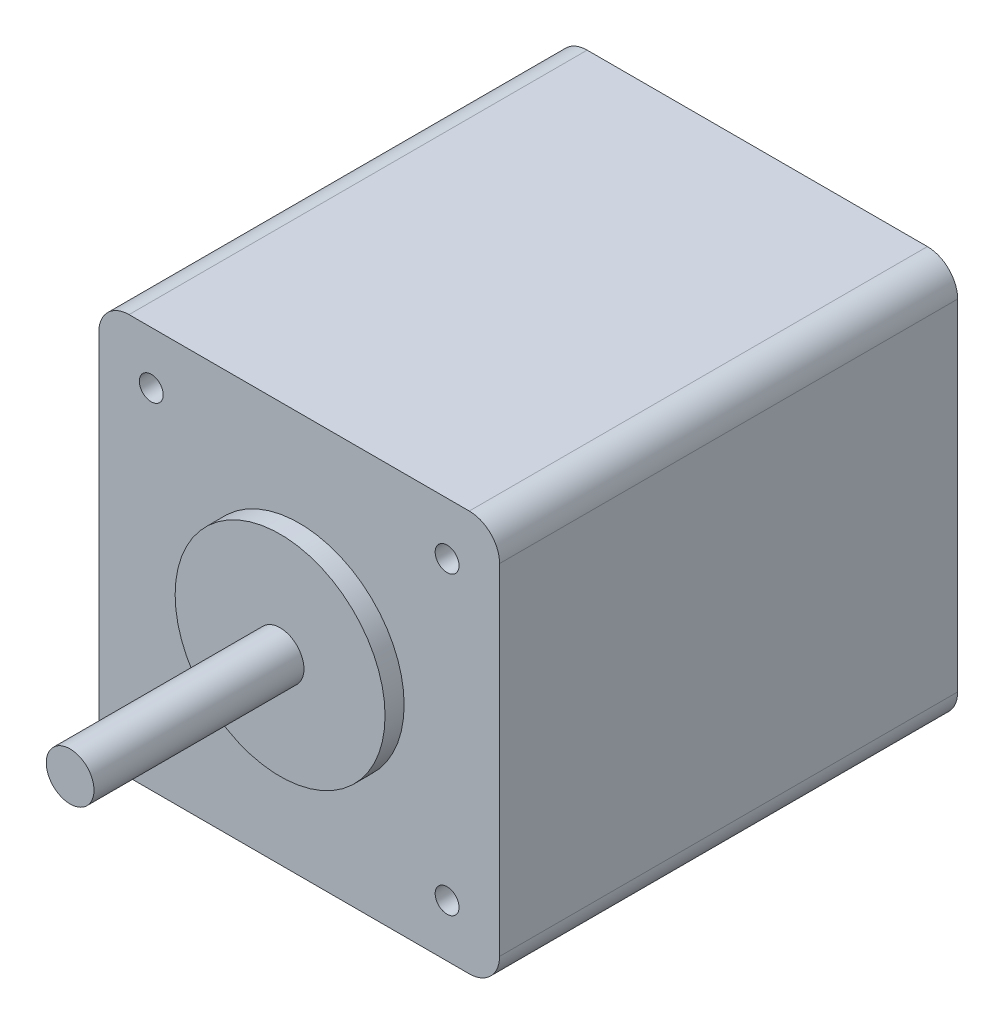
ISO-10303-21;
HEADER;
FILE_DESCRIPTION(('STEP AP214'),'2;1');
FILE_NAME('part.step','',(''),(''),'','','');
FILE_SCHEMA(('AUTOMOTIVE_DESIGN { 1 0 10303 214 1 1 1 1 }'));
ENDSEC;
DATA;
#1=APPLICATION_CONTEXT('core data for automotive mechanical design processes');
#2=APPLICATION_PROTOCOL_DEFINITION('international standard','automotive_design',2000,#1);
#3=PRODUCT_CONTEXT('',#1,'mechanical');
#4=PRODUCT('Part','Part','',(#3));
#5=PRODUCT_RELATED_PRODUCT_CATEGORY('part','',(#4));
#6=PRODUCT_DEFINITION_FORMATION('','',#4);
#7=PRODUCT_DEFINITION_CONTEXT('part definition',#1,'design');
#8=PRODUCT_DEFINITION('design','',#6,#7);
#9=PRODUCT_DEFINITION_SHAPE('','',#8);
#10=(LENGTH_UNIT() NAMED_UNIT(*) SI_UNIT(.MILLI.,.METRE.));
#11=(NAMED_UNIT(*) PLANE_ANGLE_UNIT() SI_UNIT($,.RADIAN.));
#12=(NAMED_UNIT(*) SI_UNIT($,.STERADIAN.) SOLID_ANGLE_UNIT());
#13=UNCERTAINTY_MEASURE_WITH_UNIT(LENGTH_MEASURE(1.E-05),#10,'distance_accuracy_value','');
#14=(GEOMETRIC_REPRESENTATION_CONTEXT(3) GLOBAL_UNCERTAINTY_ASSIGNED_CONTEXT((#13)) GLOBAL_UNIT_ASSIGNED_CONTEXT((#10,
#11,#12)) REPRESENTATION_CONTEXT('',''));
#15=CARTESIAN_POINT('',(0.,0.,0.));
#16=DIRECTION('',(0.,0.,1.));
#17=DIRECTION('',(1.,0.,0.));
#18=AXIS2_PLACEMENT_3D('',#15,#16,#17);
#19=CARTESIAN_POINT('',(0.,0.,57.02));
#20=DIRECTION('',(0.,0.,1.));
#21=DIRECTION('',(1.,0.,0.));
#22=AXIS2_PLACEMENT_3D('',#19,#20,#21);
#23=PLANE('',#22);
#24=CARTESIAN_POINT('',(0.,0.,57.02));
#25=DIRECTION('',(0.,0.,1.));
#26=DIRECTION('',(1.,0.,0.));
#27=AXIS2_PLACEMENT_3D('',#24,#25,#26);
#28=CIRCLE('',#27,2.5);
#29=CARTESIAN_POINT('',(2.5,0.,57.02));
#30=VERTEX_POINT('',#29);
#31=EDGE_CURVE('E20',#30,#30,#28,.F.);
#32=ORIENTED_EDGE('',*,*,#31,.F.);
#33=EDGE_LOOP('',(#32));
#34=FACE_BOUND('',#33,.T.);
#35=ADVANCED_FACE('F17',(#34),#23,.T.);
#36=CARTESIAN_POINT('',(0.,0.,33.02));
#37=DIRECTION('',(0.,0.,1.));
#38=DIRECTION('',(1.,0.,0.));
#39=AXIS2_PLACEMENT_3D('',#36,#37,#38);
#40=CYLINDRICAL_SURFACE('',#39,2.5);
#41=ORIENTED_EDGE('',*,*,#31,.T.);
#42=EDGE_LOOP('',(#41));
#43=FACE_BOUND('',#42,.T.);
#44=CARTESIAN_POINT('',(0.,0.,35.02));
#45=DIRECTION('',(0.,0.,1.));
#46=DIRECTION('',(1.,0.,0.));
#47=AXIS2_PLACEMENT_3D('',#44,#45,#46);
#48=CIRCLE('',#47,2.5);
#49=CARTESIAN_POINT('',(2.5,0.,35.02));
#50=VERTEX_POINT('',#49);
#51=EDGE_CURVE('E105',#50,#50,#48,.F.);
#52=ORIENTED_EDGE('',*,*,#51,.F.);
#53=EDGE_LOOP('',(#52));
#54=FACE_BOUND('',#53,.T.);
#55=ADVANCED_FACE('F98',(#43,#54),#40,.T.);
#56=CARTESIAN_POINT('',(-15.5,15.5,25.5199999999149));
#57=DIRECTION('',(0.,0.,1.));
#58=DIRECTION('',(0.,-1.,0.));
#59=AXIS2_PLACEMENT_3D('',#56,#57,#58);
#60=CONICAL_SURFACE('',#59,1.24999999988222,1.02974425852598);
#61=CARTESIAN_POINT('',(-15.5000000001451,15.5,24.7689242261231));
#62=VERTEX_POINT('',#61);
#63=VERTEX_LOOP('',#62);
#64=FACE_BOUND('',#63,.T.);
#65=CARTESIAN_POINT('',(-15.5,15.5,25.52));
#66=DIRECTION('',(0.,0.,1.));
#67=DIRECTION('',(1.,0.,0.));
#68=AXIS2_PLACEMENT_3D('',#65,#66,#67);
#69=CIRCLE('',#68,1.25);
#70=CARTESIAN_POINT('',(-14.25,15.5,25.52));
#71=VERTEX_POINT('',#70);
#72=EDGE_CURVE('E102',#71,#71,#69,.T.);
#73=ORIENTED_EDGE('',*,*,#72,.T.);
#74=EDGE_LOOP('',(#73));
#75=FACE_BOUND('',#74,.T.);
#76=ADVANCED_FACE('F94',(#64,#75),#60,.F.);
#77=CARTESIAN_POINT('',(-15.5,-15.5,25.5199999999149));
#78=DIRECTION('',(0.,0.,1.));
#79=DIRECTION('',(0.,-1.,0.));
#80=AXIS2_PLACEMENT_3D('',#77,#78,#79);
#81=CONICAL_SURFACE('',#80,1.24999999988222,1.02974425852598);
#82=CARTESIAN_POINT('',(-15.5000000001451,-15.5,24.7689242261231));
#83=VERTEX_POINT('',#82);
#84=VERTEX_LOOP('',#83);
#85=FACE_BOUND('',#84,.T.);
#86=CARTESIAN_POINT('',(-15.5,-15.5,25.52));
#87=DIRECTION('',(0.,0.,1.));
#88=DIRECTION('',(1.,0.,0.));
#89=AXIS2_PLACEMENT_3D('',#86,#87,#88);
#90=CIRCLE('',#89,1.25);
#91=CARTESIAN_POINT('',(-14.25,-15.5,25.52));
#92=VERTEX_POINT('',#91);
#93=EDGE_CURVE('E104',#92,#92,#90,.T.);
#94=ORIENTED_EDGE('',*,*,#93,.T.);
#95=EDGE_LOOP('',(#94));
#96=FACE_BOUND('',#95,.T.);
#97=ADVANCED_FACE('F97',(#85,#96),#81,.F.);
#98=CARTESIAN_POINT('',(15.5,-15.5,25.5199999998581));
#99=DIRECTION('',(0.,0.,1.));
#100=DIRECTION('',(1.,0.,0.));
#101=AXIS2_PLACEMENT_3D('',#98,#99,#100);
#102=CONICAL_SURFACE('',#101,1.24999999983129,1.02974425834288);
#103=CARTESIAN_POINT('',(15.4999999997472,-15.5,24.7689242260094));
#104=VERTEX_POINT('',#103);
#105=VERTEX_LOOP('',#104);
#106=FACE_BOUND('',#105,.T.);
#107=CARTESIAN_POINT('',(15.5,-15.5,25.52));
#108=DIRECTION('',(0.,0.,1.));
#109=DIRECTION('',(1.,0.,0.));
#110=AXIS2_PLACEMENT_3D('',#107,#108,#109);
#111=CIRCLE('',#110,1.25);
#112=CARTESIAN_POINT('',(16.75,-15.5,25.52));
#113=VERTEX_POINT('',#112);
#114=EDGE_CURVE('E108',#113,#113,#111,.T.);
#115=ORIENTED_EDGE('',*,*,#114,.T.);
#116=EDGE_LOOP('',(#115));
#117=FACE_BOUND('',#116,.T.);
#118=ADVANCED_FACE('F298',(#106,#117),#102,.F.);
#119=CARTESIAN_POINT('',(15.5,15.5,25.5199999998581));
#120=DIRECTION('',(0.,0.,1.));
#121=DIRECTION('',(1.,0.,0.));
#122=AXIS2_PLACEMENT_3D('',#119,#120,#121);
#123=CONICAL_SURFACE('',#122,1.24999999983129,1.02974425834288);
#124=CARTESIAN_POINT('',(15.4999999997472,15.5,24.7689242260094));
#125=VERTEX_POINT('',#124);
#126=VERTEX_LOOP('',#125);
#127=FACE_BOUND('',#126,.T.);
#128=CARTESIAN_POINT('',(15.5,15.5,25.52));
#129=DIRECTION('',(0.,0.,1.));
#130=DIRECTION('',(1.,0.,0.));
#131=AXIS2_PLACEMENT_3D('',#128,#129,#130);
#132=CIRCLE('',#131,1.25);
#133=CARTESIAN_POINT('',(16.75,15.5,25.52));
#134=VERTEX_POINT('',#133);
#135=EDGE_CURVE('E163',#134,#134,#132,.T.);
#136=ORIENTED_EDGE('',*,*,#135,.T.);
#137=EDGE_LOOP('',(#136));
#138=FACE_BOUND('',#137,.T.);
#139=ADVANCED_FACE('F261',(#127,#138),#123,.F.);
#140=CARTESIAN_POINT('',(2.5,0.,35.02));
#141=DIRECTION('',(0.,0.,1.));
#142=DIRECTION('',(1.,0.,0.));
#143=AXIS2_PLACEMENT_3D('',#140,#141,#142);
#144=PLANE('',#143);
#145=ORIENTED_EDGE('',*,*,#51,.T.);
#146=EDGE_LOOP('',(#145));
#147=FACE_BOUND('',#146,.T.);
#148=CARTESIAN_POINT('',(0.,0.,35.02));
#149=DIRECTION('',(0.,0.,1.));
#150=DIRECTION('',(1.,0.,0.));
#151=AXIS2_PLACEMENT_3D('',#148,#149,#150);
#152=CIRCLE('',#151,10.9982);
#153=CARTESIAN_POINT('',(10.9982,0.,35.02));
#154=VERTEX_POINT('',#153);
#155=EDGE_CURVE('E161',#154,#154,#152,.F.);
#156=ORIENTED_EDGE('',*,*,#155,.F.);
#157=EDGE_LOOP('',(#156));
#158=FACE_BOUND('',#157,.T.);
#159=ADVANCED_FACE('F251',(#147,#158),#144,.T.);
#160=CARTESIAN_POINT('',(-15.5,15.5,33.02));
#161=DIRECTION('',(0.,0.,1.));
#162=DIRECTION('',(1.,0.,0.));
#163=AXIS2_PLACEMENT_3D('',#160,#161,#162);
#164=CYLINDRICAL_SURFACE('',#163,1.25);
#165=CARTESIAN_POINT('',(-15.5,15.5,33.02));
#166=DIRECTION('',(0.,0.,1.));
#167=DIRECTION('',(1.,0.,0.));
#168=AXIS2_PLACEMENT_3D('',#165,#166,#167);
#169=CIRCLE('',#168,1.25);
#170=CARTESIAN_POINT('',(-14.25,15.5,33.02));
#171=VERTEX_POINT('',#170);
#172=EDGE_CURVE('E158',#171,#171,#169,.F.);
#173=ORIENTED_EDGE('',*,*,#172,.F.);
#174=EDGE_LOOP('',(#173));
#175=FACE_BOUND('',#174,.T.);
#176=ORIENTED_EDGE('',*,*,#72,.F.);
#177=EDGE_LOOP('',(#176));
#178=FACE_BOUND('',#177,.T.);
#179=ADVANCED_FACE('F248',(#175,#178),#164,.F.);
#180=CARTESIAN_POINT('',(-15.5,-15.5,33.02));
#181=DIRECTION('',(0.,0.,1.));
#182=DIRECTION('',(1.,0.,0.));
#183=AXIS2_PLACEMENT_3D('',#180,#181,#182);
#184=CYLINDRICAL_SURFACE('',#183,1.25);
#185=CARTESIAN_POINT('',(-15.5,-15.5,33.02));
#186=DIRECTION('',(0.,0.,1.));
#187=DIRECTION('',(1.,0.,0.));
#188=AXIS2_PLACEMENT_3D('',#185,#186,#187);
#189=CIRCLE('',#188,1.25);
#190=CARTESIAN_POINT('',(-14.25,-15.5,33.02));
#191=VERTEX_POINT('',#190);
#192=EDGE_CURVE('E155',#191,#191,#189,.F.);
#193=ORIENTED_EDGE('',*,*,#192,.F.);
#194=EDGE_LOOP('',(#193));
#195=FACE_BOUND('',#194,.T.);
#196=ORIENTED_EDGE('',*,*,#93,.F.);
#197=EDGE_LOOP('',(#196));
#198=FACE_BOUND('',#197,.T.);
#199=ADVANCED_FACE('F250',(#195,#198),#184,.F.);
#200=CARTESIAN_POINT('',(15.5,-15.5,33.02));
#201=DIRECTION('',(0.,0.,1.));
#202=DIRECTION('',(1.,0.,0.));
#203=AXIS2_PLACEMENT_3D('',#200,#201,#202);
#204=CYLINDRICAL_SURFACE('',#203,1.25);
#205=CARTESIAN_POINT('',(15.5,-15.5,33.02));
#206=DIRECTION('',(0.,0.,1.));
#207=DIRECTION('',(1.,0.,0.));
#208=AXIS2_PLACEMENT_3D('',#205,#206,#207);
#209=CIRCLE('',#208,1.25);
#210=CARTESIAN_POINT('',(16.75,-15.5,33.02));
#211=VERTEX_POINT('',#210);
#212=EDGE_CURVE('E152',#211,#211,#209,.F.);
#213=ORIENTED_EDGE('',*,*,#212,.F.);
#214=EDGE_LOOP('',(#213));
#215=FACE_BOUND('',#214,.T.);
#216=ORIENTED_EDGE('',*,*,#114,.F.);
#217=EDGE_LOOP('',(#216));
#218=FACE_BOUND('',#217,.T.);
#219=ADVANCED_FACE('F258',(#215,#218),#204,.F.);
#220=CARTESIAN_POINT('',(15.5,15.5,33.02));
#221=DIRECTION('',(0.,0.,1.));
#222=DIRECTION('',(1.,0.,0.));
#223=AXIS2_PLACEMENT_3D('',#220,#221,#222);
#224=CYLINDRICAL_SURFACE('',#223,1.25);
#225=CARTESIAN_POINT('',(15.5,15.5,33.02));
#226=DIRECTION('',(0.,0.,1.));
#227=DIRECTION('',(1.,0.,0.));
#228=AXIS2_PLACEMENT_3D('',#225,#226,#227);
#229=CIRCLE('',#228,1.25);
#230=CARTESIAN_POINT('',(16.75,15.5,33.02));
#231=VERTEX_POINT('',#230);
#232=EDGE_CURVE('E149',#231,#231,#229,.F.);
#233=ORIENTED_EDGE('',*,*,#232,.F.);
#234=EDGE_LOOP('',(#233));
#235=FACE_BOUND('',#234,.T.);
#236=ORIENTED_EDGE('',*,*,#135,.F.);
#237=EDGE_LOOP('',(#236));
#238=FACE_BOUND('',#237,.T.);
#239=ADVANCED_FACE('F287',(#235,#238),#224,.F.);
#240=CARTESIAN_POINT('',(0.,0.,33.02));
#241=DIRECTION('',(0.,0.,1.));
#242=DIRECTION('',(1.,0.,0.));
#243=AXIS2_PLACEMENT_3D('',#240,#241,#242);
#244=CYLINDRICAL_SURFACE('',#243,10.9982);
#245=ORIENTED_EDGE('',*,*,#155,.T.);
#246=EDGE_LOOP('',(#245));
#247=FACE_BOUND('',#246,.T.);
#248=CARTESIAN_POINT('',(0.,0.,33.02));
#249=DIRECTION('',(0.,0.,1.));
#250=DIRECTION('',(1.,0.,0.));
#251=AXIS2_PLACEMENT_3D('',#248,#249,#250);
#252=CIRCLE('',#251,10.9982);
#253=CARTESIAN_POINT('',(10.9982,0.,33.02));
#254=VERTEX_POINT('',#253);
#255=EDGE_CURVE('E146',#254,#254,#252,.F.);
#256=ORIENTED_EDGE('',*,*,#255,.F.);
#257=EDGE_LOOP('',(#256));
#258=FACE_BOUND('',#257,.T.);
#259=ADVANCED_FACE('F236',(#247,#258),#244,.T.);
#260=CARTESIAN_POINT('',(21.,-21.,33.02));
#261=DIRECTION('',(0.,0.,1.));
#262=DIRECTION('',(1.,0.,0.));
#263=AXIS2_PLACEMENT_3D('',#260,#261,#262);
#264=PLANE('',#263);
#265=DIRECTION('',(0.,1.,0.));
#266=VECTOR('',#265,1.);
#267=CARTESIAN_POINT('',(21.,-21.,33.02));
#268=LINE('',#267,#266);
#269=CARTESIAN_POINT('',(21.,17.825,33.02));
#270=VERTEX_POINT('',#269);
#271=CARTESIAN_POINT('',(21.,-17.825,33.02));
#272=VERTEX_POINT('',#271);
#273=EDGE_CURVE('E178',#270,#272,#268,.F.);
#274=ORIENTED_EDGE('',*,*,#273,.F.);
#275=CARTESIAN_POINT('',(17.825,17.825,33.02));
#276=DIRECTION('',(0.,0.,1.));
#277=DIRECTION('',(1.,0.,0.));
#278=AXIS2_PLACEMENT_3D('',#275,#276,#277);
#279=CIRCLE('',#278,3.175);
#280=CARTESIAN_POINT('',(17.825,21.,33.02));
#281=VERTEX_POINT('',#280);
#282=EDGE_CURVE('E135',#281,#270,#279,.F.);
#283=ORIENTED_EDGE('',*,*,#282,.F.);
#284=DIRECTION('',(1.,0.,0.));
#285=VECTOR('',#284,1.);
#286=CARTESIAN_POINT('',(21.,21.,33.02));
#287=LINE('',#286,#285);
#288=CARTESIAN_POINT('',(-17.825,21.,33.02));
#289=VERTEX_POINT('',#288);
#290=EDGE_CURVE('E180',#289,#281,#287,.T.);
#291=ORIENTED_EDGE('',*,*,#290,.F.);
#292=CARTESIAN_POINT('',(-17.825,17.825,33.02));
#293=DIRECTION('',(0.,0.,1.));
#294=DIRECTION('',(1.,0.,0.));
#295=AXIS2_PLACEMENT_3D('',#292,#293,#294);
#296=CIRCLE('',#295,3.175);
#297=CARTESIAN_POINT('',(-21.,17.825,33.02));
#298=VERTEX_POINT('',#297);
#299=EDGE_CURVE('E131',#298,#289,#296,.F.);
#300=ORIENTED_EDGE('',*,*,#299,.F.);
#301=DIRECTION('',(0.,1.,0.));
#302=VECTOR('',#301,1.);
#303=CARTESIAN_POINT('',(-21.,21.,33.02));
#304=LINE('',#303,#302);
#305=CARTESIAN_POINT('',(-21.,-17.825,33.02));
#306=VERTEX_POINT('',#305);
#307=EDGE_CURVE('E182',#306,#298,#304,.T.);
#308=ORIENTED_EDGE('',*,*,#307,.F.);
#309=CARTESIAN_POINT('',(-17.825,-17.825,33.02));
#310=DIRECTION('',(0.,0.,1.));
#311=DIRECTION('',(1.,0.,0.));
#312=AXIS2_PLACEMENT_3D('',#309,#310,#311);
#313=CIRCLE('',#312,3.175);
#314=CARTESIAN_POINT('',(-17.825,-21.,33.02));
#315=VERTEX_POINT('',#314);
#316=EDGE_CURVE('E143',#315,#306,#313,.F.);
#317=ORIENTED_EDGE('',*,*,#316,.F.);
#318=DIRECTION('',(1.,0.,0.));
#319=VECTOR('',#318,1.);
#320=CARTESIAN_POINT('',(-21.,-21.,33.02));
#321=LINE('',#320,#319);
#322=CARTESIAN_POINT('',(17.825,-21.,33.02));
#323=VERTEX_POINT('',#322);
#324=EDGE_CURVE('E80',#323,#315,#321,.F.);
#325=ORIENTED_EDGE('',*,*,#324,.F.);
#326=CARTESIAN_POINT('',(17.825,-17.825,33.02));
#327=DIRECTION('',(0.,0.,1.));
#328=DIRECTION('',(1.,0.,0.));
#329=AXIS2_PLACEMENT_3D('',#326,#327,#328);
#330=CIRCLE('',#329,3.175);
#331=EDGE_CURVE('E139',#272,#323,#330,.F.);
#332=ORIENTED_EDGE('',*,*,#331,.F.);
#333=EDGE_LOOP('',(#274,#283,#291,#300,#308,#317,#325,#332));
#334=FACE_BOUND('',#333,.T.);
#335=ORIENTED_EDGE('',*,*,#255,.T.);
#336=EDGE_LOOP('',(#335));
#337=FACE_BOUND('',#336,.T.);
#338=ORIENTED_EDGE('',*,*,#232,.T.);
#339=EDGE_LOOP('',(#338));
#340=FACE_BOUND('',#339,.T.);
#341=ORIENTED_EDGE('',*,*,#212,.T.);
#342=EDGE_LOOP('',(#341));
#343=FACE_BOUND('',#342,.T.);
#344=ORIENTED_EDGE('',*,*,#192,.T.);
#345=EDGE_LOOP('',(#344));
#346=FACE_BOUND('',#345,.T.);
#347=ORIENTED_EDGE('',*,*,#172,.T.);
#348=EDGE_LOOP('',(#347));
#349=FACE_BOUND('',#348,.T.);
#350=ADVANCED_FACE('F233',(#334,#337,#340,#343,#346,#349),#264,.T.);
#351=CARTESIAN_POINT('',(-17.825,-17.825,-14.98));
#352=DIRECTION('',(0.,0.,1.));
#353=DIRECTION('',(1.,0.,0.));
#354=AXIS2_PLACEMENT_3D('',#351,#352,#353);
#355=CYLINDRICAL_SURFACE('',#354,3.175);
#356=ORIENTED_EDGE('',*,*,#316,.T.);
#357=DIRECTION('',(0.,0.,1.));
#358=VECTOR('',#357,1.);
#359=CARTESIAN_POINT('',(-21.,-17.825,-14.98));
#360=LINE('',#359,#358);
#361=CARTESIAN_POINT('',(-21.,-17.825,-14.98));
#362=VERTEX_POINT('',#361);
#363=EDGE_CURVE('E130',#362,#306,#360,.T.);
#364=ORIENTED_EDGE('',*,*,#363,.F.);
#365=CARTESIAN_POINT('',(-17.825,-17.825,-14.98));
#366=DIRECTION('',(0.,0.,1.));
#367=DIRECTION('',(1.,0.,0.));
#368=AXIS2_PLACEMENT_3D('',#365,#366,#367);
#369=CIRCLE('',#368,3.175);
#370=CARTESIAN_POINT('',(-17.825,-21.,-14.98));
#371=VERTEX_POINT('',#370);
#372=EDGE_CURVE('E127',#362,#371,#369,.T.);
#373=ORIENTED_EDGE('',*,*,#372,.T.);
#374=DIRECTION('',(0.,0.,-1.));
#375=VECTOR('',#374,1.);
#376=CARTESIAN_POINT('',(-17.825,-21.,-14.98));
#377=LINE('',#376,#375);
#378=EDGE_CURVE('E142',#315,#371,#377,.T.);
#379=ORIENTED_EDGE('',*,*,#378,.F.);
#380=EDGE_LOOP('',(#356,#364,#373,#379));
#381=FACE_BOUND('',#380,.T.);
#382=ADVANCED_FACE('F225',(#381),#355,.T.);
#383=CARTESIAN_POINT('',(-21.,-21.,-14.98));
#384=DIRECTION('',(0.,-1.,0.));
#385=DIRECTION('',(0.,0.,-1.));
#386=AXIS2_PLACEMENT_3D('',#383,#384,#385);
#387=PLANE('',#386);
#388=DIRECTION('',(1.,0.,0.));
#389=VECTOR('',#388,1.);
#390=CARTESIAN_POINT('',(21.,-21.,-14.98));
#391=LINE('',#390,#389);
#392=CARTESIAN_POINT('',(17.825,-21.,-14.98));
#393=VERTEX_POINT('',#392);
#394=EDGE_CURVE('E126',#371,#393,#391,.T.);
#395=ORIENTED_EDGE('',*,*,#394,.T.);
#396=DIRECTION('',(0.,0.,1.));
#397=VECTOR('',#396,1.);
#398=CARTESIAN_POINT('',(17.825,-21.,-14.98));
#399=LINE('',#398,#397);
#400=EDGE_CURVE('E141',#323,#393,#399,.F.);
#401=ORIENTED_EDGE('',*,*,#400,.F.);
#402=ORIENTED_EDGE('',*,*,#324,.T.);
#403=ORIENTED_EDGE('',*,*,#378,.T.);
#404=EDGE_LOOP('',(#395,#401,#402,#403));
#405=FACE_BOUND('',#404,.T.);
#406=ADVANCED_FACE('F221',(#405),#387,.T.);
#407=CARTESIAN_POINT('',(17.825,-17.825,-14.98));
#408=DIRECTION('',(0.,0.,1.));
#409=DIRECTION('',(1.,0.,0.));
#410=AXIS2_PLACEMENT_3D('',#407,#408,#409);
#411=CYLINDRICAL_SURFACE('',#410,3.175);
#412=ORIENTED_EDGE('',*,*,#331,.T.);
#413=ORIENTED_EDGE('',*,*,#400,.T.);
#414=CARTESIAN_POINT('',(17.825,-17.825,-14.98));
#415=DIRECTION('',(0.,0.,1.));
#416=DIRECTION('',(1.,0.,0.));
#417=AXIS2_PLACEMENT_3D('',#414,#415,#416);
#418=CIRCLE('',#417,3.175);
#419=CARTESIAN_POINT('',(21.,-17.825,-14.98));
#420=VERTEX_POINT('',#419);
#421=EDGE_CURVE('E123',#393,#420,#418,.T.);
#422=ORIENTED_EDGE('',*,*,#421,.T.);
#423=DIRECTION('',(0.,0.,-1.));
#424=VECTOR('',#423,1.);
#425=CARTESIAN_POINT('',(21.,-17.825,-14.98));
#426=LINE('',#425,#424);
#427=EDGE_CURVE('E138',#272,#420,#426,.T.);
#428=ORIENTED_EDGE('',*,*,#427,.F.);
#429=EDGE_LOOP('',(#412,#413,#422,#428));
#430=FACE_BOUND('',#429,.T.);
#431=ADVANCED_FACE('F220',(#430),#411,.T.);
#432=CARTESIAN_POINT('',(21.,-21.,-14.98));
#433=DIRECTION('',(1.,0.,0.));
#434=DIRECTION('',(0.,0.,-1.));
#435=AXIS2_PLACEMENT_3D('',#432,#433,#434);
#436=PLANE('',#435);
#437=ORIENTED_EDGE('',*,*,#273,.T.);
#438=ORIENTED_EDGE('',*,*,#427,.T.);
#439=DIRECTION('',(0.,1.,0.));
#440=VECTOR('',#439,1.);
#441=CARTESIAN_POINT('',(21.,-21.,-14.98));
#442=LINE('',#441,#440);
#443=CARTESIAN_POINT('',(21.,17.825,-14.98));
#444=VERTEX_POINT('',#443);
#445=EDGE_CURVE('E122',#420,#444,#442,.T.);
#446=ORIENTED_EDGE('',*,*,#445,.T.);
#447=DIRECTION('',(0.,0.,1.));
#448=VECTOR('',#447,1.);
#449=CARTESIAN_POINT('',(21.,17.825,-14.98));
#450=LINE('',#449,#448);
#451=EDGE_CURVE('E137',#270,#444,#450,.F.);
#452=ORIENTED_EDGE('',*,*,#451,.F.);
#453=EDGE_LOOP('',(#437,#438,#446,#452));
#454=FACE_BOUND('',#453,.T.);
#455=ADVANCED_FACE('F214',(#454),#436,.T.);
#456=CARTESIAN_POINT('',(17.825,17.825,-14.98));
#457=DIRECTION('',(0.,0.,1.));
#458=DIRECTION('',(1.,0.,0.));
#459=AXIS2_PLACEMENT_3D('',#456,#457,#458);
#460=CYLINDRICAL_SURFACE('',#459,3.175);
#461=ORIENTED_EDGE('',*,*,#282,.T.);
#462=ORIENTED_EDGE('',*,*,#451,.T.);
#463=CARTESIAN_POINT('',(17.825,17.825,-14.98));
#464=DIRECTION('',(0.,0.,1.));
#465=DIRECTION('',(1.,0.,0.));
#466=AXIS2_PLACEMENT_3D('',#463,#464,#465);
#467=CIRCLE('',#466,3.175);
#468=CARTESIAN_POINT('',(17.825,21.,-14.98));
#469=VERTEX_POINT('',#468);
#470=EDGE_CURVE('E119',#444,#469,#467,.T.);
#471=ORIENTED_EDGE('',*,*,#470,.T.);
#472=DIRECTION('',(0.,0.,1.));
#473=VECTOR('',#472,1.);
#474=CARTESIAN_POINT('',(17.825,21.,-14.98));
#475=LINE('',#474,#473);
#476=EDGE_CURVE('E134',#281,#469,#475,.F.);
#477=ORIENTED_EDGE('',*,*,#476,.F.);
#478=EDGE_LOOP('',(#461,#462,#471,#477));
#479=FACE_BOUND('',#478,.T.);
#480=ADVANCED_FACE('F209',(#479),#460,.T.);
#481=CARTESIAN_POINT('',(21.,21.,-14.98));
#482=DIRECTION('',(0.,1.,0.));
#483=DIRECTION('',(0.,0.,1.));
#484=AXIS2_PLACEMENT_3D('',#481,#482,#483);
#485=PLANE('',#484);
#486=ORIENTED_EDGE('',*,*,#290,.T.);
#487=ORIENTED_EDGE('',*,*,#476,.T.);
#488=DIRECTION('',(1.,0.,0.));
#489=VECTOR('',#488,1.);
#490=CARTESIAN_POINT('',(21.,21.,-14.98));
#491=LINE('',#490,#489);
#492=CARTESIAN_POINT('',(-17.825,21.,-14.98));
#493=VERTEX_POINT('',#492);
#494=EDGE_CURVE('E118',#469,#493,#491,.F.);
#495=ORIENTED_EDGE('',*,*,#494,.T.);
#496=DIRECTION('',(0.,0.,1.));
#497=VECTOR('',#496,1.);
#498=CARTESIAN_POINT('',(-17.825,21.,-14.98));
#499=LINE('',#498,#497);
#500=EDGE_CURVE('E133',#289,#493,#499,.F.);
#501=ORIENTED_EDGE('',*,*,#500,.F.);
#502=EDGE_LOOP('',(#486,#487,#495,#501));
#503=FACE_BOUND('',#502,.T.);
#504=ADVANCED_FACE('F201',(#503),#485,.T.);
#505=CARTESIAN_POINT('',(-17.825,17.825,-14.98));
#506=DIRECTION('',(0.,0.,1.));
#507=DIRECTION('',(1.,0.,0.));
#508=AXIS2_PLACEMENT_3D('',#505,#506,#507);
#509=CYLINDRICAL_SURFACE('',#508,3.175);
#510=ORIENTED_EDGE('',*,*,#299,.T.);
#511=ORIENTED_EDGE('',*,*,#500,.T.);
#512=CARTESIAN_POINT('',(-17.825,17.825,-14.98));
#513=DIRECTION('',(0.,0.,1.));
#514=DIRECTION('',(1.,0.,0.));
#515=AXIS2_PLACEMENT_3D('',#512,#513,#514);
#516=CIRCLE('',#515,3.175);
#517=CARTESIAN_POINT('',(-21.,17.825,-14.98));
#518=VERTEX_POINT('',#517);
#519=EDGE_CURVE('E26',#493,#518,#516,.T.);
#520=ORIENTED_EDGE('',*,*,#519,.T.);
#521=DIRECTION('',(0.,0.,1.));
#522=VECTOR('',#521,1.);
#523=CARTESIAN_POINT('',(-21.,17.825,-14.98));
#524=LINE('',#523,#522);
#525=EDGE_CURVE('E34',#298,#518,#524,.F.);
#526=ORIENTED_EDGE('',*,*,#525,.F.);
#527=EDGE_LOOP('',(#510,#511,#520,#526));
#528=FACE_BOUND('',#527,.T.);
#529=ADVANCED_FACE('F229',(#528),#509,.T.);
#530=CARTESIAN_POINT('',(-21.,21.,-14.98));
#531=DIRECTION('',(-1.,0.,0.));
#532=DIRECTION('',(0.,0.,1.));
#533=AXIS2_PLACEMENT_3D('',#530,#531,#532);
#534=PLANE('',#533);
#535=DIRECTION('',(0.,1.,0.));
#536=VECTOR('',#535,1.);
#537=CARTESIAN_POINT('',(-21.,-21.,-14.98));
#538=LINE('',#537,#536);
#539=EDGE_CURVE('E11',#518,#362,#538,.F.);
#540=ORIENTED_EDGE('',*,*,#539,.T.);
#541=ORIENTED_EDGE('',*,*,#363,.T.);
#542=ORIENTED_EDGE('',*,*,#307,.T.);
#543=ORIENTED_EDGE('',*,*,#525,.T.);
#544=EDGE_LOOP('',(#540,#541,#542,#543));
#545=FACE_BOUND('',#544,.T.);
#546=ADVANCED_FACE('F227',(#545),#534,.T.);
#547=CARTESIAN_POINT('',(21.,-21.,-14.98));
#548=DIRECTION('',(0.,0.,1.));
#549=DIRECTION('',(1.,0.,0.));
#550=AXIS2_PLACEMENT_3D('',#547,#548,#549);
#551=PLANE('',#550);
#552=ORIENTED_EDGE('',*,*,#519,.F.);
#553=ORIENTED_EDGE('',*,*,#494,.F.);
#554=ORIENTED_EDGE('',*,*,#470,.F.);
#555=ORIENTED_EDGE('',*,*,#445,.F.);
#556=ORIENTED_EDGE('',*,*,#421,.F.);
#557=ORIENTED_EDGE('',*,*,#394,.F.);
#558=ORIENTED_EDGE('',*,*,#372,.F.);
#559=ORIENTED_EDGE('',*,*,#539,.F.);
#560=EDGE_LOOP('',(#552,#553,#554,#555,#556,#557,#558,#559));
#561=FACE_BOUND('',#560,.T.);
#562=ADVANCED_FACE('F206',(#561),#551,.F.);
#563=CLOSED_SHELL('',(#35,#55,#76,#97,#118,#139,#159,#179,#199,#219,#239,#259,#350,#382,#406,
#431,#455,#480,#504,#529,#546,#562));
#564=MANIFOLD_SOLID_BREP('B1',#563);
#565=ADVANCED_BREP_SHAPE_REPRESENTATION('',(#18,#564),#14);
#566=SHAPE_DEFINITION_REPRESENTATION(#9,#565);
ENDSEC;
END-ISO-10303-21;
